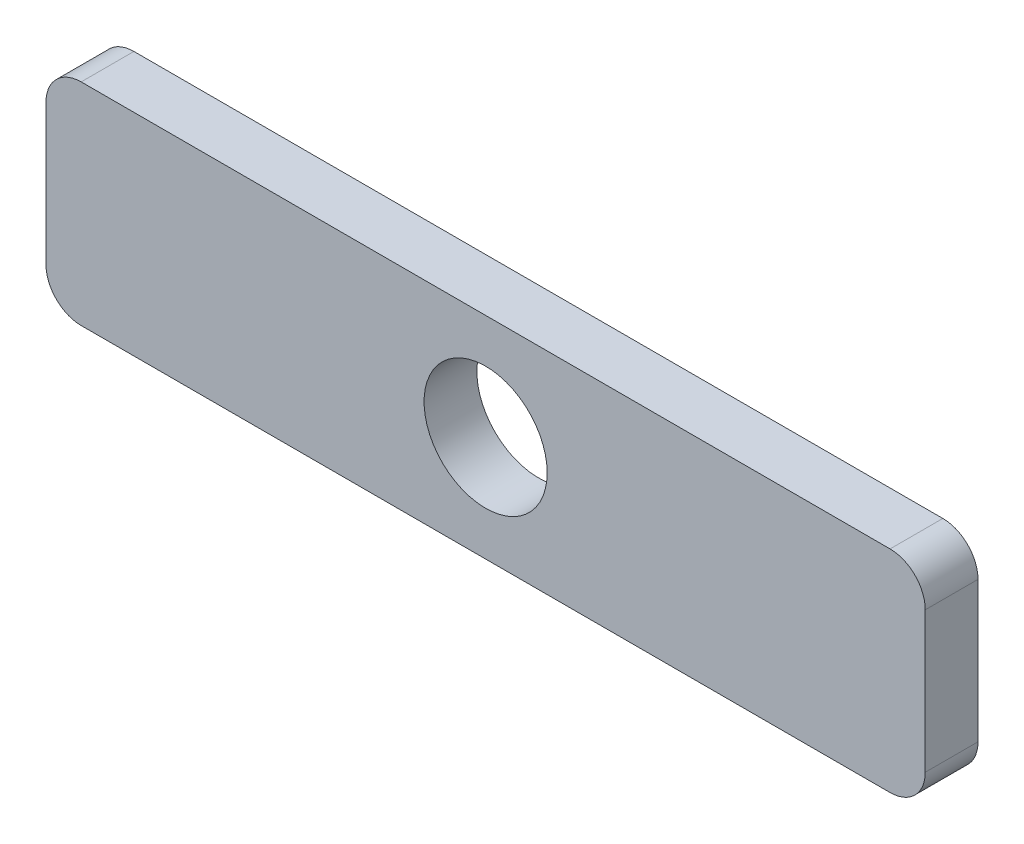
ISO-10303-21;
HEADER;
FILE_DESCRIPTION(('STEP AP214'),'2;1');
FILE_NAME('part.step','',(''),(''),'','','');
FILE_SCHEMA(('AUTOMOTIVE_DESIGN { 1 0 10303 214 1 1 1 1 }'));
ENDSEC;
DATA;
#1=APPLICATION_CONTEXT('core data for automotive mechanical design processes');
#2=APPLICATION_PROTOCOL_DEFINITION('international standard','automotive_design',2000,#1);
#3=PRODUCT_CONTEXT('',#1,'mechanical');
#4=PRODUCT('Part','Part','',(#3));
#5=PRODUCT_RELATED_PRODUCT_CATEGORY('part','',(#4));
#6=PRODUCT_DEFINITION_FORMATION('','',#4);
#7=PRODUCT_DEFINITION_CONTEXT('part definition',#1,'design');
#8=PRODUCT_DEFINITION('design','',#6,#7);
#9=PRODUCT_DEFINITION_SHAPE('','',#8);
#10=(LENGTH_UNIT() NAMED_UNIT(*) SI_UNIT(.MILLI.,.METRE.));
#11=(NAMED_UNIT(*) PLANE_ANGLE_UNIT() SI_UNIT($,.RADIAN.));
#12=(NAMED_UNIT(*) SI_UNIT($,.STERADIAN.) SOLID_ANGLE_UNIT());
#13=UNCERTAINTY_MEASURE_WITH_UNIT(LENGTH_MEASURE(1.E-05),#10,'distance_accuracy_value','');
#14=(GEOMETRIC_REPRESENTATION_CONTEXT(3) GLOBAL_UNCERTAINTY_ASSIGNED_CONTEXT((#13)) GLOBAL_UNIT_ASSIGNED_CONTEXT((#10,
#11,#12)) REPRESENTATION_CONTEXT('',''));
#15=CARTESIAN_POINT('',(0.,0.,0.));
#16=DIRECTION('',(0.,0.,1.));
#17=DIRECTION('',(1.,0.,0.));
#18=AXIS2_PLACEMENT_3D('',#15,#16,#17);
#19=CARTESIAN_POINT('',(0.,0.,3.));
#20=DIRECTION('',(0.,0.,-1.));
#21=DIRECTION('',(-1.,0.,0.));
#22=AXIS2_PLACEMENT_3D('',#19,#20,#21);
#23=PLANE('',#22);
#24=DIRECTION('',(1.,0.,0.));
#25=VECTOR('',#24,1.);
#26=CARTESIAN_POINT('',(-25.,-6.,3.));
#27=LINE('',#26,#25);
#28=CARTESIAN_POINT('',(-23.,-6.,3.));
#29=VERTEX_POINT('',#28);
#30=CARTESIAN_POINT('',(23.,-6.,3.));
#31=VERTEX_POINT('',#30);
#32=EDGE_CURVE('E134',#29,#31,#27,.T.);
#33=ORIENTED_EDGE('',*,*,#32,.T.);
#34=CARTESIAN_POINT('',(23.,-4.,3.));
#35=DIRECTION('',(0.,0.,-1.));
#36=DIRECTION('',(-1.,0.,0.));
#37=AXIS2_PLACEMENT_3D('',#34,#35,#36);
#38=CIRCLE('',#37,2.);
#39=CARTESIAN_POINT('',(25.,-4.,3.));
#40=VERTEX_POINT('',#39);
#41=EDGE_CURVE('E153',#31,#40,#38,.F.);
#42=ORIENTED_EDGE('',*,*,#41,.T.);
#43=DIRECTION('',(0.,1.,0.));
#44=VECTOR('',#43,1.);
#45=CARTESIAN_POINT('',(25.,-6.,3.));
#46=LINE('',#45,#44);
#47=CARTESIAN_POINT('',(25.,4.,3.));
#48=VERTEX_POINT('',#47);
#49=EDGE_CURVE('E117',#40,#48,#46,.T.);
#50=ORIENTED_EDGE('',*,*,#49,.T.);
#51=CARTESIAN_POINT('',(23.,4.,3.));
#52=DIRECTION('',(0.,0.,-1.));
#53=DIRECTION('',(-1.,0.,0.));
#54=AXIS2_PLACEMENT_3D('',#51,#52,#53);
#55=CIRCLE('',#54,2.);
#56=CARTESIAN_POINT('',(23.,6.,3.));
#57=VERTEX_POINT('',#56);
#58=EDGE_CURVE('E151',#48,#57,#55,.F.);
#59=ORIENTED_EDGE('',*,*,#58,.T.);
#60=DIRECTION('',(-1.,0.,0.));
#61=VECTOR('',#60,1.);
#62=CARTESIAN_POINT('',(-25.,6.,3.));
#63=LINE('',#62,#61);
#64=CARTESIAN_POINT('',(-23.,6.,3.));
#65=VERTEX_POINT('',#64);
#66=EDGE_CURVE('E173',#57,#65,#63,.T.);
#67=ORIENTED_EDGE('',*,*,#66,.T.);
#68=CARTESIAN_POINT('',(-23.,4.,3.));
#69=DIRECTION('',(0.,0.,-1.));
#70=DIRECTION('',(-1.,0.,0.));
#71=AXIS2_PLACEMENT_3D('',#68,#69,#70);
#72=CIRCLE('',#71,2.);
#73=CARTESIAN_POINT('',(-25.,4.,3.));
#74=VERTEX_POINT('',#73);
#75=EDGE_CURVE('E52',#65,#74,#72,.F.);
#76=ORIENTED_EDGE('',*,*,#75,.T.);
#77=DIRECTION('',(0.,-1.,0.));
#78=VECTOR('',#77,1.);
#79=CARTESIAN_POINT('',(-25.,-6.,3.));
#80=LINE('',#79,#78);
#81=CARTESIAN_POINT('',(-25.,-4.,3.));
#82=VERTEX_POINT('',#81);
#83=EDGE_CURVE('E163',#74,#82,#80,.T.);
#84=ORIENTED_EDGE('',*,*,#83,.T.);
#85=CARTESIAN_POINT('',(-23.,-4.,3.));
#86=DIRECTION('',(0.,0.,-1.));
#87=DIRECTION('',(-1.,0.,0.));
#88=AXIS2_PLACEMENT_3D('',#85,#86,#87);
#89=CIRCLE('',#88,2.);
#90=EDGE_CURVE('E149',#82,#29,#89,.F.);
#91=ORIENTED_EDGE('',*,*,#90,.T.);
#92=EDGE_LOOP('',(#33,#42,#50,#59,#67,#76,#84,#91));
#93=FACE_BOUND('',#92,.T.);
#94=CARTESIAN_POINT('',(0.,0.,3.));
#95=DIRECTION('',(0.,0.,1.));
#96=DIRECTION('',(1.,0.,0.));
#97=AXIS2_PLACEMENT_3D('',#94,#95,#96);
#98=CIRCLE('',#97,3.5);
#99=CARTESIAN_POINT('',(3.50000000000001,0.,3.));
#100=VERTEX_POINT('',#99);
#101=EDGE_CURVE('E125',#100,#100,#98,.T.);
#102=ORIENTED_EDGE('',*,*,#101,.F.);
#103=EDGE_LOOP('',(#102));
#104=FACE_BOUND('',#103,.T.);
#105=ADVANCED_FACE('F32',(#93,#104),#23,.F.);
#106=CARTESIAN_POINT('',(0.,0.,0.));
#107=DIRECTION('',(0.,0.,-1.));
#108=DIRECTION('',(-1.,0.,0.));
#109=AXIS2_PLACEMENT_3D('',#106,#107,#108);
#110=PLANE('',#109);
#111=DIRECTION('',(0.,1.,0.));
#112=VECTOR('',#111,1.);
#113=CARTESIAN_POINT('',(25.,-6.,0.));
#114=LINE('',#113,#112);
#115=CARTESIAN_POINT('',(25.,-4.,0.));
#116=VERTEX_POINT('',#115);
#117=CARTESIAN_POINT('',(25.,4.,0.));
#118=VERTEX_POINT('',#117);
#119=EDGE_CURVE('E114',#116,#118,#114,.T.);
#120=ORIENTED_EDGE('',*,*,#119,.F.);
#121=CARTESIAN_POINT('',(23.,-4.,0.));
#122=DIRECTION('',(0.,0.,-1.));
#123=DIRECTION('',(-1.,0.,0.));
#124=AXIS2_PLACEMENT_3D('',#121,#122,#123);
#125=CIRCLE('',#124,2.);
#126=CARTESIAN_POINT('',(23.,-6.,0.));
#127=VERTEX_POINT('',#126);
#128=EDGE_CURVE('E97',#116,#127,#125,.T.);
#129=ORIENTED_EDGE('',*,*,#128,.T.);
#130=DIRECTION('',(1.,0.,0.));
#131=VECTOR('',#130,1.);
#132=CARTESIAN_POINT('',(-25.,-6.,0.));
#133=LINE('',#132,#131);
#134=CARTESIAN_POINT('',(-23.,-6.,0.));
#135=VERTEX_POINT('',#134);
#136=EDGE_CURVE('E138',#135,#127,#133,.T.);
#137=ORIENTED_EDGE('',*,*,#136,.F.);
#138=CARTESIAN_POINT('',(-23.,-4.,0.));
#139=DIRECTION('',(0.,0.,-1.));
#140=DIRECTION('',(-1.,0.,0.));
#141=AXIS2_PLACEMENT_3D('',#138,#139,#140);
#142=CIRCLE('',#141,2.);
#143=CARTESIAN_POINT('',(-25.,-4.,0.));
#144=VERTEX_POINT('',#143);
#145=EDGE_CURVE('E142',#135,#144,#142,.T.);
#146=ORIENTED_EDGE('',*,*,#145,.T.);
#147=DIRECTION('',(0.,-1.,0.));
#148=VECTOR('',#147,1.);
#149=CARTESIAN_POINT('',(-25.,-6.,0.));
#150=LINE('',#149,#148);
#151=CARTESIAN_POINT('',(-25.,4.,0.));
#152=VERTEX_POINT('',#151);
#153=EDGE_CURVE('E128',#152,#144,#150,.T.);
#154=ORIENTED_EDGE('',*,*,#153,.F.);
#155=CARTESIAN_POINT('',(-23.,4.,0.));
#156=DIRECTION('',(0.,0.,-1.));
#157=DIRECTION('',(-1.,0.,0.));
#158=AXIS2_PLACEMENT_3D('',#155,#156,#157);
#159=CIRCLE('',#158,2.);
#160=CARTESIAN_POINT('',(-23.,6.,0.));
#161=VERTEX_POINT('',#160);
#162=EDGE_CURVE('E118',#152,#161,#159,.T.);
#163=ORIENTED_EDGE('',*,*,#162,.T.);
#164=DIRECTION('',(-1.,0.,0.));
#165=VECTOR('',#164,1.);
#166=CARTESIAN_POINT('',(-25.,6.,0.));
#167=LINE('',#166,#165);
#168=CARTESIAN_POINT('',(23.,6.,0.));
#169=VERTEX_POINT('',#168);
#170=EDGE_CURVE('E124',#169,#161,#167,.T.);
#171=ORIENTED_EDGE('',*,*,#170,.F.);
#172=CARTESIAN_POINT('',(23.,4.,0.));
#173=DIRECTION('',(0.,0.,-1.));
#174=DIRECTION('',(-1.,0.,0.));
#175=AXIS2_PLACEMENT_3D('',#172,#173,#174);
#176=CIRCLE('',#175,2.);
#177=EDGE_CURVE('E108',#169,#118,#176,.T.);
#178=ORIENTED_EDGE('',*,*,#177,.T.);
#179=EDGE_LOOP('',(#120,#129,#137,#146,#154,#163,#171,#178));
#180=FACE_BOUND('',#179,.T.);
#181=CARTESIAN_POINT('',(0.,0.,0.));
#182=DIRECTION('',(0.,0.,1.));
#183=DIRECTION('',(1.,0.,0.));
#184=AXIS2_PLACEMENT_3D('',#181,#182,#183);
#185=CIRCLE('',#184,3.5);
#186=CARTESIAN_POINT('',(3.50000000000001,0.,0.));
#187=VERTEX_POINT('',#186);
#188=EDGE_CURVE('E131',#187,#187,#185,.T.);
#189=ORIENTED_EDGE('',*,*,#188,.T.);
#190=EDGE_LOOP('',(#189));
#191=FACE_BOUND('',#190,.T.);
#192=ADVANCED_FACE('F121',(#180,#191),#110,.T.);
#193=CARTESIAN_POINT('',(25.,-6.,3.));
#194=DIRECTION('',(-1.,0.,0.));
#195=DIRECTION('',(0.,0.,1.));
#196=AXIS2_PLACEMENT_3D('',#193,#194,#195);
#197=PLANE('',#196);
#198=ORIENTED_EDGE('',*,*,#49,.F.);
#199=DIRECTION('',(0.,0.,-1.));
#200=VECTOR('',#199,1.);
#201=CARTESIAN_POINT('',(25.,-4.,3.));
#202=LINE('',#201,#200);
#203=EDGE_CURVE('E101',#40,#116,#202,.T.);
#204=ORIENTED_EDGE('',*,*,#203,.T.);
#205=ORIENTED_EDGE('',*,*,#119,.T.);
#206=DIRECTION('',(0.,0.,-1.));
#207=VECTOR('',#206,1.);
#208=CARTESIAN_POINT('',(25.,4.,3.));
#209=LINE('',#208,#207);
#210=EDGE_CURVE('E119',#118,#48,#209,.F.);
#211=ORIENTED_EDGE('',*,*,#210,.T.);
#212=EDGE_LOOP('',(#198,#204,#205,#211));
#213=FACE_BOUND('',#212,.T.);
#214=ADVANCED_FACE('F113',(#213),#197,.F.);
#215=CARTESIAN_POINT('',(-25.,6.,3.));
#216=DIRECTION('',(0.,-1.,0.));
#217=DIRECTION('',(0.,0.,-1.));
#218=AXIS2_PLACEMENT_3D('',#215,#216,#217);
#219=PLANE('',#218);
#220=ORIENTED_EDGE('',*,*,#66,.F.);
#221=DIRECTION('',(0.,0.,-1.));
#222=VECTOR('',#221,1.);
#223=CARTESIAN_POINT('',(23.,6.,3.));
#224=LINE('',#223,#222);
#225=EDGE_CURVE('E157',#57,#169,#224,.T.);
#226=ORIENTED_EDGE('',*,*,#225,.T.);
#227=ORIENTED_EDGE('',*,*,#170,.T.);
#228=DIRECTION('',(0.,0.,-1.));
#229=VECTOR('',#228,1.);
#230=CARTESIAN_POINT('',(-23.,6.,3.));
#231=LINE('',#230,#229);
#232=EDGE_CURVE('E155',#161,#65,#231,.F.);
#233=ORIENTED_EDGE('',*,*,#232,.T.);
#234=EDGE_LOOP('',(#220,#226,#227,#233));
#235=FACE_BOUND('',#234,.T.);
#236=ADVANCED_FACE('F201',(#235),#219,.F.);
#237=CARTESIAN_POINT('',(-25.,-6.,3.));
#238=DIRECTION('',(1.,0.,0.));
#239=DIRECTION('',(0.,0.,-1.));
#240=AXIS2_PLACEMENT_3D('',#237,#238,#239);
#241=PLANE('',#240);
#242=ORIENTED_EDGE('',*,*,#153,.T.);
#243=DIRECTION('',(0.,0.,-1.));
#244=VECTOR('',#243,1.);
#245=CARTESIAN_POINT('',(-25.,-4.,3.));
#246=LINE('',#245,#244);
#247=EDGE_CURVE('E11',#144,#82,#246,.F.);
#248=ORIENTED_EDGE('',*,*,#247,.T.);
#249=ORIENTED_EDGE('',*,*,#83,.F.);
#250=DIRECTION('',(0.,0.,-1.));
#251=VECTOR('',#250,1.);
#252=CARTESIAN_POINT('',(-25.,4.,3.));
#253=LINE('',#252,#251);
#254=EDGE_CURVE('E40',#74,#152,#253,.T.);
#255=ORIENTED_EDGE('',*,*,#254,.T.);
#256=EDGE_LOOP('',(#242,#248,#249,#255));
#257=FACE_BOUND('',#256,.T.);
#258=ADVANCED_FACE('F162',(#257),#241,.F.);
#259=CARTESIAN_POINT('',(-25.,-6.,3.));
#260=DIRECTION('',(0.,1.,0.));
#261=DIRECTION('',(0.,0.,1.));
#262=AXIS2_PLACEMENT_3D('',#259,#260,#261);
#263=PLANE('',#262);
#264=ORIENTED_EDGE('',*,*,#136,.T.);
#265=DIRECTION('',(0.,0.,-1.));
#266=VECTOR('',#265,1.);
#267=CARTESIAN_POINT('',(23.,-6.,3.));
#268=LINE('',#267,#266);
#269=EDGE_CURVE('E102',#127,#31,#268,.F.);
#270=ORIENTED_EDGE('',*,*,#269,.T.);
#271=ORIENTED_EDGE('',*,*,#32,.F.);
#272=DIRECTION('',(0.,0.,-1.));
#273=VECTOR('',#272,1.);
#274=CARTESIAN_POINT('',(-23.,-6.,3.));
#275=LINE('',#274,#273);
#276=EDGE_CURVE('E107',#29,#135,#275,.T.);
#277=ORIENTED_EDGE('',*,*,#276,.T.);
#278=EDGE_LOOP('',(#264,#270,#271,#277));
#279=FACE_BOUND('',#278,.T.);
#280=ADVANCED_FACE('F171',(#279),#263,.F.);
#281=CARTESIAN_POINT('',(0.,0.,3.));
#282=DIRECTION('',(0.,0.,-1.));
#283=DIRECTION('',(-1.,0.,0.));
#284=AXIS2_PLACEMENT_3D('',#281,#282,#283);
#285=CYLINDRICAL_SURFACE('',#284,3.5);
#286=ORIENTED_EDGE('',*,*,#101,.T.);
#287=EDGE_LOOP('',(#286));
#288=FACE_BOUND('',#287,.T.);
#289=ORIENTED_EDGE('',*,*,#188,.F.);
#290=EDGE_LOOP('',(#289));
#291=FACE_BOUND('',#290,.T.);
#292=ADVANCED_FACE('F180',(#288,#291),#285,.F.);
#293=CARTESIAN_POINT('',(23.,-4.,3.));
#294=DIRECTION('',(0.,0.,-1.));
#295=DIRECTION('',(-1.,0.,0.));
#296=AXIS2_PLACEMENT_3D('',#293,#294,#295);
#297=CYLINDRICAL_SURFACE('',#296,2.);
#298=ORIENTED_EDGE('',*,*,#41,.F.);
#299=ORIENTED_EDGE('',*,*,#269,.F.);
#300=ORIENTED_EDGE('',*,*,#128,.F.);
#301=ORIENTED_EDGE('',*,*,#203,.F.);
#302=EDGE_LOOP('',(#298,#299,#300,#301));
#303=FACE_BOUND('',#302,.T.);
#304=ADVANCED_FACE('F100',(#303),#297,.T.);
#305=CARTESIAN_POINT('',(23.,4.,3.));
#306=DIRECTION('',(0.,0.,-1.));
#307=DIRECTION('',(-1.,0.,0.));
#308=AXIS2_PLACEMENT_3D('',#305,#306,#307);
#309=CYLINDRICAL_SURFACE('',#308,2.);
#310=ORIENTED_EDGE('',*,*,#58,.F.);
#311=ORIENTED_EDGE('',*,*,#210,.F.);
#312=ORIENTED_EDGE('',*,*,#177,.F.);
#313=ORIENTED_EDGE('',*,*,#225,.F.);
#314=EDGE_LOOP('',(#310,#311,#312,#313));
#315=FACE_BOUND('',#314,.T.);
#316=ADVANCED_FACE('F188',(#315),#309,.T.);
#317=CARTESIAN_POINT('',(-23.,-4.,3.));
#318=DIRECTION('',(0.,0.,-1.));
#319=DIRECTION('',(-1.,0.,0.));
#320=AXIS2_PLACEMENT_3D('',#317,#318,#319);
#321=CYLINDRICAL_SURFACE('',#320,2.);
#322=ORIENTED_EDGE('',*,*,#90,.F.);
#323=ORIENTED_EDGE('',*,*,#247,.F.);
#324=ORIENTED_EDGE('',*,*,#145,.F.);
#325=ORIENTED_EDGE('',*,*,#276,.F.);
#326=EDGE_LOOP('',(#322,#323,#324,#325));
#327=FACE_BOUND('',#326,.T.);
#328=ADVANCED_FACE('F168',(#327),#321,.T.);
#329=CARTESIAN_POINT('',(-23.,4.,3.));
#330=DIRECTION('',(0.,0.,-1.));
#331=DIRECTION('',(-1.,0.,0.));
#332=AXIS2_PLACEMENT_3D('',#329,#330,#331);
#333=CYLINDRICAL_SURFACE('',#332,2.);
#334=ORIENTED_EDGE('',*,*,#75,.F.);
#335=ORIENTED_EDGE('',*,*,#232,.F.);
#336=ORIENTED_EDGE('',*,*,#162,.F.);
#337=ORIENTED_EDGE('',*,*,#254,.F.);
#338=EDGE_LOOP('',(#334,#335,#336,#337));
#339=FACE_BOUND('',#338,.T.);
#340=ADVANCED_FACE('F34',(#339),#333,.T.);
#341=CLOSED_SHELL('',(#105,#192,#214,#236,#258,#280,#292,#304,#316,#328,#340));
#342=MANIFOLD_SOLID_BREP('B2',#341);
#343=ADVANCED_BREP_SHAPE_REPRESENTATION('',(#18,#342),#14);
#344=SHAPE_DEFINITION_REPRESENTATION(#9,#343);
ENDSEC;
END-ISO-10303-21;
